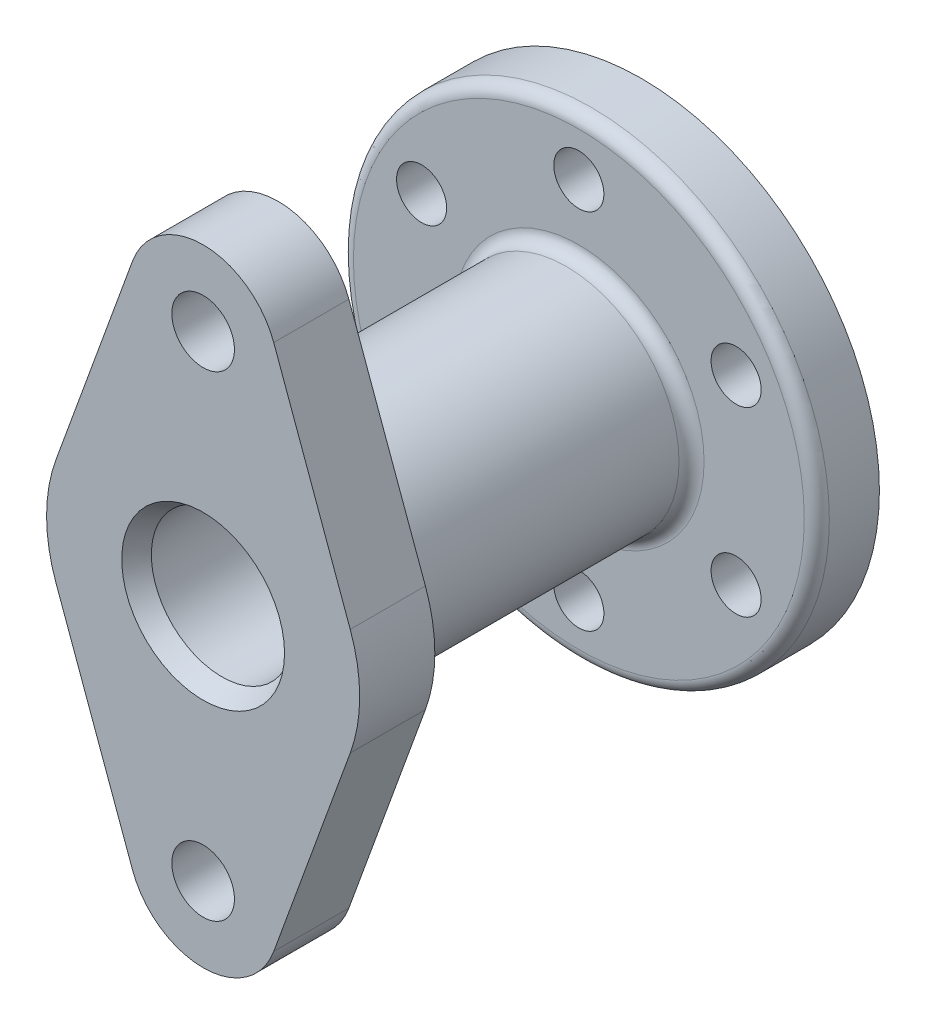
ISO-10303-21;
HEADER;
FILE_DESCRIPTION(('STEP AP214'),'2;1');
FILE_NAME('part.step','',(''),(''),'','','');
FILE_SCHEMA(('AUTOMOTIVE_DESIGN { 1 0 10303 214 1 1 1 1 }'));
ENDSEC;
DATA;
#1=APPLICATION_CONTEXT('core data for automotive mechanical design processes');
#2=APPLICATION_PROTOCOL_DEFINITION('international standard','automotive_design',2000,#1);
#3=PRODUCT_CONTEXT('',#1,'mechanical');
#4=PRODUCT('Part','Part','',(#3));
#5=PRODUCT_RELATED_PRODUCT_CATEGORY('part','',(#4));
#6=PRODUCT_DEFINITION_FORMATION('','',#4);
#7=PRODUCT_DEFINITION_CONTEXT('part definition',#1,'design');
#8=PRODUCT_DEFINITION('design','',#6,#7);
#9=PRODUCT_DEFINITION_SHAPE('','',#8);
#10=(LENGTH_UNIT() NAMED_UNIT(*) SI_UNIT(.MILLI.,.METRE.));
#11=(NAMED_UNIT(*) PLANE_ANGLE_UNIT() SI_UNIT($,.RADIAN.));
#12=(NAMED_UNIT(*) SI_UNIT($,.STERADIAN.) SOLID_ANGLE_UNIT());
#13=UNCERTAINTY_MEASURE_WITH_UNIT(LENGTH_MEASURE(1.E-05),#10,'distance_accuracy_value','');
#14=(GEOMETRIC_REPRESENTATION_CONTEXT(3) GLOBAL_UNCERTAINTY_ASSIGNED_CONTEXT((#13)) GLOBAL_UNIT_ASSIGNED_CONTEXT((#10,
#11,#12)) REPRESENTATION_CONTEXT('',''));
#15=CARTESIAN_POINT('',(0.,0.,0.));
#16=DIRECTION('',(0.,0.,1.));
#17=DIRECTION('',(1.,0.,0.));
#18=AXIS2_PLACEMENT_3D('',#15,#16,#17);
#19=CARTESIAN_POINT('',(23.4915408833646,-8.55263157894737,6.));
#20=DIRECTION('',(0.939661635334586,-0.342105263157895,0.));
#21=DIRECTION('',(0.342105263157895,0.939661635334586,0.));
#22=AXIS2_PLACEMENT_3D('',#19,#20,#21);
#23=PLANE('',#22);
#24=DIRECTION('',(-0.342105263157895,-0.939661635334586,0.));
#25=VECTOR('',#24,1.);
#26=CARTESIAN_POINT('',(23.4915408833646,-8.55263157894737,-6.));
#27=LINE('',#26,#25);
#28=CARTESIAN_POINT('',(23.4915408833646,-8.55263157894737,-6.));
#29=VERTEX_POINT('',#28);
#30=CARTESIAN_POINT('',(11.275939624015,-42.1052631578947,-6.));
#31=VERTEX_POINT('',#30);
#32=EDGE_CURVE('E244',#29,#31,#27,.T.);
#33=ORIENTED_EDGE('',*,*,#32,.F.);
#34=DIRECTION('',(0.,0.,-1.));
#35=VECTOR('',#34,1.);
#36=CARTESIAN_POINT('',(23.4915408833646,-8.55263157894737,6.));
#37=LINE('',#36,#35);
#38=CARTESIAN_POINT('',(23.4915408833646,-8.55263157894737,6.));
#39=VERTEX_POINT('',#38);
#40=EDGE_CURVE('E100',#39,#29,#37,.T.);
#41=ORIENTED_EDGE('',*,*,#40,.F.);
#42=DIRECTION('',(-0.342105263157895,-0.939661635334586,0.));
#43=VECTOR('',#42,1.);
#44=CARTESIAN_POINT('',(23.4915408833646,-8.55263157894737,6.));
#45=LINE('',#44,#43);
#46=CARTESIAN_POINT('',(11.275939624015,-42.1052631578947,6.));
#47=VERTEX_POINT('',#46);
#48=EDGE_CURVE('E219',#39,#47,#45,.T.);
#49=ORIENTED_EDGE('',*,*,#48,.T.);
#50=DIRECTION('',(0.,0.,-1.));
#51=VECTOR('',#50,1.);
#52=CARTESIAN_POINT('',(11.275939624015,-42.1052631578947,6.));
#53=LINE('',#52,#51);
#54=EDGE_CURVE('E64',#47,#31,#53,.T.);
#55=ORIENTED_EDGE('',*,*,#54,.T.);
#56=EDGE_LOOP('',(#33,#41,#49,#55));
#57=FACE_BOUND('',#56,.T.);
#58=ADVANCED_FACE('F46',(#57),#23,.T.);
#59=CARTESIAN_POINT('',(0.,0.,6.));
#60=DIRECTION('',(0.,0.,-1.));
#61=DIRECTION('',(-1.,0.,0.));
#62=AXIS2_PLACEMENT_3D('',#59,#60,#61);
#63=CYLINDRICAL_SURFACE('',#62,25.);
#64=CARTESIAN_POINT('',(0.,0.,-6.));
#65=DIRECTION('',(0.,0.,1.));
#66=DIRECTION('',(1.,0.,0.));
#67=AXIS2_PLACEMENT_3D('',#64,#65,#66);
#68=CIRCLE('',#67,25.);
#69=CARTESIAN_POINT('',(23.4915408833646,8.55263157894737,-6.));
#70=VERTEX_POINT('',#69);
#71=EDGE_CURVE('E247',#29,#70,#68,.T.);
#72=ORIENTED_EDGE('',*,*,#71,.T.);
#73=DIRECTION('',(0.,0.,-1.));
#74=VECTOR('',#73,1.);
#75=CARTESIAN_POINT('',(23.4915408833646,8.55263157894737,6.));
#76=LINE('',#75,#74);
#77=CARTESIAN_POINT('',(23.4915408833646,8.55263157894737,6.));
#78=VERTEX_POINT('',#77);
#79=EDGE_CURVE('E156',#78,#70,#76,.T.);
#80=ORIENTED_EDGE('',*,*,#79,.F.);
#81=CARTESIAN_POINT('',(0.,0.,6.));
#82=DIRECTION('',(0.,0.,1.));
#83=DIRECTION('',(1.,0.,0.));
#84=AXIS2_PLACEMENT_3D('',#81,#82,#83);
#85=CIRCLE('',#84,25.);
#86=EDGE_CURVE('E222',#39,#78,#85,.T.);
#87=ORIENTED_EDGE('',*,*,#86,.F.);
#88=ORIENTED_EDGE('',*,*,#40,.T.);
#89=EDGE_LOOP('',(#72,#80,#87,#88));
#90=FACE_BOUND('',#89,.T.);
#91=ADVANCED_FACE('F290',(#90),#63,.T.);
#92=CARTESIAN_POINT('',(23.4915408833646,8.55263157894737,6.));
#93=DIRECTION('',(-0.939661635334586,-0.342105263157895,0.));
#94=DIRECTION('',(0.342105263157895,-0.939661635334586,0.));
#95=AXIS2_PLACEMENT_3D('',#92,#93,#94);
#96=PLANE('',#95);
#97=DIRECTION('',(-0.342105263157895,0.939661635334586,0.));
#98=VECTOR('',#97,1.);
#99=CARTESIAN_POINT('',(23.4915408833646,8.55263157894737,-6.));
#100=LINE('',#99,#98);
#101=CARTESIAN_POINT('',(11.275939624015,42.1052631578947,-6.));
#102=VERTEX_POINT('',#101);
#103=EDGE_CURVE('E251',#70,#102,#100,.T.);
#104=ORIENTED_EDGE('',*,*,#103,.T.);
#105=DIRECTION('',(0.,0.,-1.));
#106=VECTOR('',#105,1.);
#107=CARTESIAN_POINT('',(11.275939624015,42.1052631578947,6.));
#108=LINE('',#107,#106);
#109=CARTESIAN_POINT('',(11.275939624015,42.1052631578947,6.));
#110=VERTEX_POINT('',#109);
#111=EDGE_CURVE('E152',#110,#102,#108,.T.);
#112=ORIENTED_EDGE('',*,*,#111,.F.);
#113=DIRECTION('',(-0.342105263157895,0.939661635334586,0.));
#114=VECTOR('',#113,1.);
#115=CARTESIAN_POINT('',(23.4915408833646,8.55263157894737,6.));
#116=LINE('',#115,#114);
#117=EDGE_CURVE('E226',#78,#110,#116,.T.);
#118=ORIENTED_EDGE('',*,*,#117,.F.);
#119=ORIENTED_EDGE('',*,*,#79,.T.);
#120=EDGE_LOOP('',(#104,#112,#118,#119));
#121=FACE_BOUND('',#120,.T.);
#122=ADVANCED_FACE('F295',(#121),#96,.F.);
#123=CARTESIAN_POINT('',(0.,38.,6.));
#124=DIRECTION('',(0.,0.,-1.));
#125=DIRECTION('',(-1.,0.,0.));
#126=AXIS2_PLACEMENT_3D('',#123,#124,#125);
#127=CYLINDRICAL_SURFACE('',#126,12.);
#128=CARTESIAN_POINT('',(0.,38.,-6.));
#129=DIRECTION('',(0.,0.,1.));
#130=DIRECTION('',(1.,0.,0.));
#131=AXIS2_PLACEMENT_3D('',#128,#129,#130);
#132=CIRCLE('',#131,12.);
#133=CARTESIAN_POINT('',(-11.275939624015,42.1052631578947,-6.));
#134=VERTEX_POINT('',#133);
#135=EDGE_CURVE('E255',#102,#134,#132,.T.);
#136=ORIENTED_EDGE('',*,*,#135,.T.);
#137=DIRECTION('',(0.,0.,-1.));
#138=VECTOR('',#137,1.);
#139=CARTESIAN_POINT('',(-11.275939624015,42.1052631578947,6.));
#140=LINE('',#139,#138);
#141=CARTESIAN_POINT('',(-11.275939624015,42.1052631578947,6.));
#142=VERTEX_POINT('',#141);
#143=EDGE_CURVE('E145',#142,#134,#140,.T.);
#144=ORIENTED_EDGE('',*,*,#143,.F.);
#145=CARTESIAN_POINT('',(0.,38.,6.));
#146=DIRECTION('',(0.,0.,1.));
#147=DIRECTION('',(1.,0.,0.));
#148=AXIS2_PLACEMENT_3D('',#145,#146,#147);
#149=CIRCLE('',#148,12.);
#150=EDGE_CURVE('E230',#110,#142,#149,.T.);
#151=ORIENTED_EDGE('',*,*,#150,.F.);
#152=ORIENTED_EDGE('',*,*,#111,.T.);
#153=EDGE_LOOP('',(#136,#144,#151,#152));
#154=FACE_BOUND('',#153,.T.);
#155=ADVANCED_FACE('F594',(#154),#127,.T.);
#156=CARTESIAN_POINT('',(-23.4915408833646,8.55263157894737,6.));
#157=DIRECTION('',(-0.939661635334586,0.342105263157895,0.));
#158=DIRECTION('',(-0.342105263157895,-0.939661635334586,0.));
#159=AXIS2_PLACEMENT_3D('',#156,#157,#158);
#160=PLANE('',#159);
#161=DIRECTION('',(0.342105263157895,0.939661635334586,0.));
#162=VECTOR('',#161,1.);
#163=CARTESIAN_POINT('',(-23.4915408833646,8.55263157894737,-6.));
#164=LINE('',#163,#162);
#165=CARTESIAN_POINT('',(-23.4915408833646,8.55263157894737,-6.));
#166=VERTEX_POINT('',#165);
#167=EDGE_CURVE('E259',#166,#134,#164,.T.);
#168=ORIENTED_EDGE('',*,*,#167,.F.);
#169=DIRECTION('',(0.,0.,-1.));
#170=VECTOR('',#169,1.);
#171=CARTESIAN_POINT('',(-23.4915408833646,8.55263157894737,6.));
#172=LINE('',#171,#170);
#173=CARTESIAN_POINT('',(-23.4915408833646,8.55263157894737,6.));
#174=VERTEX_POINT('',#173);
#175=EDGE_CURVE('E141',#174,#166,#172,.T.);
#176=ORIENTED_EDGE('',*,*,#175,.F.);
#177=DIRECTION('',(0.342105263157895,0.939661635334586,0.));
#178=VECTOR('',#177,1.);
#179=CARTESIAN_POINT('',(-23.4915408833646,8.55263157894737,6.));
#180=LINE('',#179,#178);
#181=EDGE_CURVE('E133',#174,#142,#180,.T.);
#182=ORIENTED_EDGE('',*,*,#181,.T.);
#183=ORIENTED_EDGE('',*,*,#143,.T.);
#184=EDGE_LOOP('',(#168,#176,#182,#183));
#185=FACE_BOUND('',#184,.T.);
#186=ADVANCED_FACE('F585',(#185),#160,.T.);
#187=CARTESIAN_POINT('',(0.,0.,6.));
#188=DIRECTION('',(0.,0.,-1.));
#189=DIRECTION('',(-1.,0.,0.));
#190=AXIS2_PLACEMENT_3D('',#187,#188,#189);
#191=CYLINDRICAL_SURFACE('',#190,25.);
#192=CARTESIAN_POINT('',(0.,0.,-6.));
#193=DIRECTION('',(0.,0.,1.));
#194=DIRECTION('',(1.,0.,0.));
#195=AXIS2_PLACEMENT_3D('',#192,#193,#194);
#196=CIRCLE('',#195,25.);
#197=CARTESIAN_POINT('',(-23.4915408833646,-8.55263157894737,-6.));
#198=VERTEX_POINT('',#197);
#199=EDGE_CURVE('E139',#166,#198,#196,.T.);
#200=ORIENTED_EDGE('',*,*,#199,.T.);
#201=DIRECTION('',(0.,0.,-1.));
#202=VECTOR('',#201,1.);
#203=CARTESIAN_POINT('',(-23.4915408833646,-8.55263157894737,6.));
#204=LINE('',#203,#202);
#205=CARTESIAN_POINT('',(-23.4915408833646,-8.55263157894737,6.));
#206=VERTEX_POINT('',#205);
#207=EDGE_CURVE('E120',#206,#198,#204,.T.);
#208=ORIENTED_EDGE('',*,*,#207,.F.);
#209=CARTESIAN_POINT('',(0.,0.,6.));
#210=DIRECTION('',(0.,0.,1.));
#211=DIRECTION('',(1.,0.,0.));
#212=AXIS2_PLACEMENT_3D('',#209,#210,#211);
#213=CIRCLE('',#212,25.);
#214=EDGE_CURVE('E126',#174,#206,#213,.T.);
#215=ORIENTED_EDGE('',*,*,#214,.F.);
#216=ORIENTED_EDGE('',*,*,#175,.T.);
#217=EDGE_LOOP('',(#200,#208,#215,#216));
#218=FACE_BOUND('',#217,.T.);
#219=ADVANCED_FACE('F137',(#218),#191,.T.);
#220=CARTESIAN_POINT('',(-23.4915408833646,-8.55263157894737,6.));
#221=DIRECTION('',(0.939661635334586,0.342105263157895,0.));
#222=DIRECTION('',(-0.342105263157895,0.939661635334586,0.));
#223=AXIS2_PLACEMENT_3D('',#220,#221,#222);
#224=PLANE('',#223);
#225=DIRECTION('',(0.342105263157895,-0.939661635334586,0.));
#226=VECTOR('',#225,1.);
#227=CARTESIAN_POINT('',(-23.4915408833646,-8.55263157894737,-6.));
#228=LINE('',#227,#226);
#229=CARTESIAN_POINT('',(-11.275939624015,-42.1052631578947,-6.));
#230=VERTEX_POINT('',#229);
#231=EDGE_CURVE('E265',#198,#230,#228,.T.);
#232=ORIENTED_EDGE('',*,*,#231,.T.);
#233=DIRECTION('',(0.,0.,-1.));
#234=VECTOR('',#233,1.);
#235=CARTESIAN_POINT('',(-11.275939624015,-42.1052631578947,6.));
#236=LINE('',#235,#234);
#237=CARTESIAN_POINT('',(-11.275939624015,-42.1052631578947,6.));
#238=VERTEX_POINT('',#237);
#239=EDGE_CURVE('E91',#238,#230,#236,.T.);
#240=ORIENTED_EDGE('',*,*,#239,.F.);
#241=DIRECTION('',(0.342105263157895,-0.939661635334586,0.));
#242=VECTOR('',#241,1.);
#243=CARTESIAN_POINT('',(-23.4915408833646,-8.55263157894737,6.));
#244=LINE('',#243,#242);
#245=EDGE_CURVE('E116',#206,#238,#244,.T.);
#246=ORIENTED_EDGE('',*,*,#245,.F.);
#247=ORIENTED_EDGE('',*,*,#207,.T.);
#248=EDGE_LOOP('',(#232,#240,#246,#247));
#249=FACE_BOUND('',#248,.T.);
#250=ADVANCED_FACE('F118',(#249),#224,.F.);
#251=CARTESIAN_POINT('',(0.,38.,6.));
#252=DIRECTION('',(0.,0.,-1.));
#253=DIRECTION('',(-1.,0.,0.));
#254=AXIS2_PLACEMENT_3D('',#251,#252,#253);
#255=CYLINDRICAL_SURFACE('',#254,5.);
#256=CARTESIAN_POINT('',(0.,38.,6.));
#257=DIRECTION('',(0.,0.,1.));
#258=DIRECTION('',(1.,0.,0.));
#259=AXIS2_PLACEMENT_3D('',#256,#257,#258);
#260=CIRCLE('',#259,5.);
#261=CARTESIAN_POINT('',(5.,38.,6.));
#262=VERTEX_POINT('',#261);
#263=EDGE_CURVE('E214',#262,#262,#260,.T.);
#264=ORIENTED_EDGE('',*,*,#263,.T.);
#265=EDGE_LOOP('',(#264));
#266=FACE_BOUND('',#265,.T.);
#267=CARTESIAN_POINT('',(0.,38.,-6.));
#268=DIRECTION('',(0.,0.,1.));
#269=DIRECTION('',(1.,0.,0.));
#270=AXIS2_PLACEMENT_3D('',#267,#268,#269);
#271=CIRCLE('',#270,5.);
#272=CARTESIAN_POINT('',(5.,38.,-6.));
#273=VERTEX_POINT('',#272);
#274=EDGE_CURVE('E240',#273,#273,#271,.T.);
#275=ORIENTED_EDGE('',*,*,#274,.F.);
#276=EDGE_LOOP('',(#275));
#277=FACE_BOUND('',#276,.T.);
#278=ADVANCED_FACE('F284',(#266,#277),#255,.F.);
#279=CARTESIAN_POINT('',(0.,-38.,6.));
#280=DIRECTION('',(0.,0.,-1.));
#281=DIRECTION('',(-1.,0.,0.));
#282=AXIS2_PLACEMENT_3D('',#279,#280,#281);
#283=CYLINDRICAL_SURFACE('',#282,5.);
#284=CARTESIAN_POINT('',(0.,-38.,6.));
#285=DIRECTION('',(0.,0.,1.));
#286=DIRECTION('',(1.,0.,0.));
#287=AXIS2_PLACEMENT_3D('',#284,#285,#286);
#288=CIRCLE('',#287,5.);
#289=CARTESIAN_POINT('',(5.,-38.,6.));
#290=VERTEX_POINT('',#289);
#291=EDGE_CURVE('E210',#290,#290,#288,.F.);
#292=ORIENTED_EDGE('',*,*,#291,.F.);
#293=EDGE_LOOP('',(#292));
#294=FACE_BOUND('',#293,.T.);
#295=CARTESIAN_POINT('',(0.,-38.,-6.));
#296=DIRECTION('',(0.,0.,1.));
#297=DIRECTION('',(1.,0.,0.));
#298=AXIS2_PLACEMENT_3D('',#295,#296,#297);
#299=CIRCLE('',#298,5.);
#300=CARTESIAN_POINT('',(5.,-38.,-6.));
#301=VERTEX_POINT('',#300);
#302=EDGE_CURVE('E203',#301,#301,#299,.F.);
#303=ORIENTED_EDGE('',*,*,#302,.T.);
#304=EDGE_LOOP('',(#303));
#305=FACE_BOUND('',#304,.T.);
#306=ADVANCED_FACE('F276',(#294,#305),#283,.F.);
#307=CARTESIAN_POINT('',(0.,-38.,6.));
#308=DIRECTION('',(0.,0.,-1.));
#309=DIRECTION('',(-1.,0.,0.));
#310=AXIS2_PLACEMENT_3D('',#307,#308,#309);
#311=CYLINDRICAL_SURFACE('',#310,12.);
#312=CARTESIAN_POINT('',(0.,-38.,-6.));
#313=DIRECTION('',(0.,0.,1.));
#314=DIRECTION('',(1.,0.,0.));
#315=AXIS2_PLACEMENT_3D('',#312,#313,#314);
#316=CIRCLE('',#315,12.);
#317=EDGE_CURVE('E215',#31,#230,#316,.F.);
#318=ORIENTED_EDGE('',*,*,#317,.F.);
#319=ORIENTED_EDGE('',*,*,#54,.F.);
#320=CARTESIAN_POINT('',(0.,-38.,6.));
#321=DIRECTION('',(0.,0.,1.));
#322=DIRECTION('',(1.,0.,0.));
#323=AXIS2_PLACEMENT_3D('',#320,#321,#322);
#324=CIRCLE('',#323,12.);
#325=EDGE_CURVE('E125',#47,#238,#324,.F.);
#326=ORIENTED_EDGE('',*,*,#325,.T.);
#327=ORIENTED_EDGE('',*,*,#239,.T.);
#328=EDGE_LOOP('',(#318,#319,#326,#327));
#329=FACE_BOUND('',#328,.T.);
#330=ADVANCED_FACE('F274',(#329),#311,.T.);
#331=CARTESIAN_POINT('',(0.,0.,6.));
#332=DIRECTION('',(0.,0.,1.));
#333=DIRECTION('',(1.,0.,0.));
#334=AXIS2_PLACEMENT_3D('',#331,#332,#333);
#335=PLANE('',#334);
#336=CARTESIAN_POINT('',(0.,0.,6.));
#337=DIRECTION('',(0.,0.,1.));
#338=DIRECTION('',(1.,0.,0.));
#339=AXIS2_PLACEMENT_3D('',#336,#337,#338);
#340=CIRCLE('',#339,13.);
#341=CARTESIAN_POINT('',(13.,0.,6.));
#342=VERTEX_POINT('',#341);
#343=EDGE_CURVE('E197',#342,#342,#340,.T.);
#344=ORIENTED_EDGE('',*,*,#343,.F.);
#345=EDGE_LOOP('',(#344));
#346=FACE_BOUND('',#345,.T.);
#347=ORIENTED_EDGE('',*,*,#291,.T.);
#348=EDGE_LOOP('',(#347));
#349=FACE_BOUND('',#348,.T.);
#350=ORIENTED_EDGE('',*,*,#263,.F.);
#351=EDGE_LOOP('',(#350));
#352=FACE_BOUND('',#351,.T.);
#353=ORIENTED_EDGE('',*,*,#48,.F.);
#354=ORIENTED_EDGE('',*,*,#86,.T.);
#355=ORIENTED_EDGE('',*,*,#117,.T.);
#356=ORIENTED_EDGE('',*,*,#150,.T.);
#357=ORIENTED_EDGE('',*,*,#181,.F.);
#358=ORIENTED_EDGE('',*,*,#214,.T.);
#359=ORIENTED_EDGE('',*,*,#245,.T.);
#360=ORIENTED_EDGE('',*,*,#325,.F.);
#361=EDGE_LOOP('',(#353,#354,#355,#356,#357,#358,#359,#360));
#362=FACE_BOUND('',#361,.T.);
#363=ADVANCED_FACE('F131',(#346,#349,#352,#362),#335,.T.);
#364=CARTESIAN_POINT('',(0.,0.,-6.));
#365=DIRECTION('',(0.,0.,1.));
#366=DIRECTION('',(1.,0.,0.));
#367=AXIS2_PLACEMENT_3D('',#364,#365,#366);
#368=PLANE('',#367);
#369=CARTESIAN_POINT('',(0.,0.,-6.));
#370=DIRECTION('',(0.,0.,1.));
#371=DIRECTION('',(1.,0.,0.));
#372=AXIS2_PLACEMENT_3D('',#369,#370,#371);
#373=CIRCLE('',#372,18.);
#374=CARTESIAN_POINT('',(18.,0.,-6.));
#375=VERTEX_POINT('',#374);
#376=EDGE_CURVE('E162',#375,#375,#373,.F.);
#377=ORIENTED_EDGE('',*,*,#376,.F.);
#378=EDGE_LOOP('',(#377));
#379=FACE_BOUND('',#378,.T.);
#380=ORIENTED_EDGE('',*,*,#302,.F.);
#381=EDGE_LOOP('',(#380));
#382=FACE_BOUND('',#381,.T.);
#383=ORIENTED_EDGE('',*,*,#274,.T.);
#384=EDGE_LOOP('',(#383));
#385=FACE_BOUND('',#384,.T.);
#386=ORIENTED_EDGE('',*,*,#32,.T.);
#387=ORIENTED_EDGE('',*,*,#317,.T.);
#388=ORIENTED_EDGE('',*,*,#231,.F.);
#389=ORIENTED_EDGE('',*,*,#199,.F.);
#390=ORIENTED_EDGE('',*,*,#167,.T.);
#391=ORIENTED_EDGE('',*,*,#135,.F.);
#392=ORIENTED_EDGE('',*,*,#103,.F.);
#393=ORIENTED_EDGE('',*,*,#71,.F.);
#394=EDGE_LOOP('',(#386,#387,#388,#389,#390,#391,#392,#393));
#395=FACE_BOUND('',#394,.T.);
#396=ADVANCED_FACE('F272',(#379,#382,#385,#395),#368,.F.);
#397=CARTESIAN_POINT('',(0.,0.,6.));
#398=DIRECTION('',(0.,0.,1.));
#399=DIRECTION('',(1.,0.,0.));
#400=AXIS2_PLACEMENT_3D('',#397,#398,#399);
#401=CONICAL_SURFACE('',#400,13.,0.5235987755983);
#402=CARTESIAN_POINT('',(0.,0.,3.));
#403=DIRECTION('',(0.,0.,1.));
#404=DIRECTION('',(1.,0.,0.));
#405=AXIS2_PLACEMENT_3D('',#402,#403,#404);
#406=CIRCLE('',#405,11.2679491924311);
#407=CARTESIAN_POINT('',(11.2679491924311,0.,3.));
#408=VERTEX_POINT('',#407);
#409=EDGE_CURVE('E206',#408,#408,#406,.T.);
#410=ORIENTED_EDGE('',*,*,#409,.F.);
#411=EDGE_LOOP('',(#410));
#412=FACE_BOUND('',#411,.T.);
#413=ORIENTED_EDGE('',*,*,#343,.T.);
#414=EDGE_LOOP('',(#413));
#415=FACE_BOUND('',#414,.T.);
#416=ADVANCED_FACE('F310',(#412,#415),#401,.F.);
#417=CARTESIAN_POINT('',(0.,0.,-54.));
#418=DIRECTION('',(0.,0.,1.));
#419=DIRECTION('',(1.,0.,0.));
#420=AXIS2_PLACEMENT_3D('',#417,#418,#419);
#421=CYLINDRICAL_SURFACE('',#420,18.);
#422=CARTESIAN_POINT('',(0.,0.,-52.));
#423=DIRECTION('',(0.,0.,-1.));
#424=DIRECTION('',(-1.,0.,0.));
#425=AXIS2_PLACEMENT_3D('',#422,#423,#424);
#426=CIRCLE('',#425,18.);
#427=CARTESIAN_POINT('',(-18.,0.,-52.));
#428=VERTEX_POINT('',#427);
#429=EDGE_CURVE('E11',#428,#428,#426,.F.);
#430=ORIENTED_EDGE('',*,*,#429,.T.);
#431=EDGE_LOOP('',(#430));
#432=FACE_BOUND('',#431,.T.);
#433=ORIENTED_EDGE('',*,*,#376,.T.);
#434=EDGE_LOOP('',(#433));
#435=FACE_BOUND('',#434,.T.);
#436=ADVANCED_FACE('F190',(#432,#435),#421,.T.);
#437=CARTESIAN_POINT('',(0.,0.,-64.));
#438=DIRECTION('',(0.,0.,1.));
#439=DIRECTION('',(1.,0.,0.));
#440=AXIS2_PLACEMENT_3D('',#437,#438,#439);
#441=CYLINDRICAL_SURFACE('',#440,38.);
#442=CARTESIAN_POINT('',(0.,0.,-56.));
#443=DIRECTION('',(0.,0.,-1.));
#444=DIRECTION('',(-1.,0.,0.));
#445=AXIS2_PLACEMENT_3D('',#442,#443,#444);
#446=CIRCLE('',#445,38.);
#447=CARTESIAN_POINT('',(-38.,0.,-56.));
#448=VERTEX_POINT('',#447);
#449=EDGE_CURVE('E166',#448,#448,#446,.T.);
#450=ORIENTED_EDGE('',*,*,#449,.T.);
#451=EDGE_LOOP('',(#450));
#452=FACE_BOUND('',#451,.T.);
#453=CARTESIAN_POINT('',(0.,0.,-64.));
#454=DIRECTION('',(0.,0.,-1.));
#455=DIRECTION('',(-1.,0.,0.));
#456=AXIS2_PLACEMENT_3D('',#453,#454,#455);
#457=CIRCLE('',#456,38.);
#458=CARTESIAN_POINT('',(-38.,0.,-64.));
#459=VERTEX_POINT('',#458);
#460=EDGE_CURVE('E194',#459,#459,#457,.T.);
#461=ORIENTED_EDGE('',*,*,#460,.F.);
#462=EDGE_LOOP('',(#461));
#463=FACE_BOUND('',#462,.T.);
#464=ADVANCED_FACE('F186',(#452,#463),#441,.T.);
#465=CARTESIAN_POINT('',(0.,0.,-64.));
#466=DIRECTION('',(0.,0.,-1.));
#467=DIRECTION('',(-1.,0.,0.));
#468=AXIS2_PLACEMENT_3D('',#465,#466,#467);
#469=PLANE('',#468);
#470=CARTESIAN_POINT('',(0.,29.,-64.));
#471=DIRECTION('',(0.,0.,1.));
#472=DIRECTION('',(1.,0.,0.));
#473=AXIS2_PLACEMENT_3D('',#470,#471,#472);
#474=CIRCLE('',#473,4.);
#475=CARTESIAN_POINT('',(4.,29.,-64.));
#476=VERTEX_POINT('',#475);
#477=EDGE_CURVE('E367',#476,#476,#474,.T.);
#478=ORIENTED_EDGE('',*,*,#477,.T.);
#479=EDGE_LOOP('',(#478));
#480=FACE_BOUND('',#479,.T.);
#481=CARTESIAN_POINT('',(-25.1147367097486,14.5000000000003,-64.));
#482=DIRECTION('',(0.,0.,1.));
#483=DIRECTION('',(1.,0.,0.));
#484=AXIS2_PLACEMENT_3D('',#481,#482,#483);
#485=CIRCLE('',#484,4.);
#486=CARTESIAN_POINT('',(-21.1147367097486,14.5000000000003,-64.));
#487=VERTEX_POINT('',#486);
#488=EDGE_CURVE('E388',#487,#487,#485,.T.);
#489=ORIENTED_EDGE('',*,*,#488,.T.);
#490=EDGE_LOOP('',(#489));
#491=FACE_BOUND('',#490,.T.);
#492=CARTESIAN_POINT('',(-25.1147367097489,-14.4999999999998,-64.));
#493=DIRECTION('',(0.,0.,1.));
#494=DIRECTION('',(1.,0.,0.));
#495=AXIS2_PLACEMENT_3D('',#492,#493,#494);
#496=CIRCLE('',#495,4.);
#497=CARTESIAN_POINT('',(-21.1147367097489,-14.4999999999998,-64.));
#498=VERTEX_POINT('',#497);
#499=EDGE_CURVE('E387',#498,#498,#496,.T.);
#500=ORIENTED_EDGE('',*,*,#499,.T.);
#501=EDGE_LOOP('',(#500));
#502=FACE_BOUND('',#501,.T.);
#503=CARTESIAN_POINT('',(-2.02505917652902E-13,-29.,-64.));
#504=DIRECTION('',(0.,0.,1.));
#505=DIRECTION('',(1.,0.,0.));
#506=AXIS2_PLACEMENT_3D('',#503,#504,#505);
#507=CIRCLE('',#506,4.);
#508=CARTESIAN_POINT('',(3.9999999999998,-29.,-64.));
#509=VERTEX_POINT('',#508);
#510=EDGE_CURVE('E407',#509,#509,#507,.T.);
#511=ORIENTED_EDGE('',*,*,#510,.T.);
#512=EDGE_LOOP('',(#511));
#513=FACE_BOUND('',#512,.T.);
#514=CARTESIAN_POINT('',(25.1147367097486,-14.5000000000001,-64.));
#515=DIRECTION('',(0.,0.,1.));
#516=DIRECTION('',(1.,0.,0.));
#517=AXIS2_PLACEMENT_3D('',#514,#515,#516);
#518=CIRCLE('',#517,4.);
#519=CARTESIAN_POINT('',(29.1147367097486,-14.5000000000001,-64.));
#520=VERTEX_POINT('',#519);
#521=EDGE_CURVE('E399',#520,#520,#518,.T.);
#522=ORIENTED_EDGE('',*,*,#521,.T.);
#523=EDGE_LOOP('',(#522));
#524=FACE_BOUND('',#523,.T.);
#525=CARTESIAN_POINT('',(25.1147367097488,14.4999999999999,-64.));
#526=DIRECTION('',(0.,0.,1.));
#527=DIRECTION('',(1.,0.,0.));
#528=AXIS2_PLACEMENT_3D('',#525,#526,#527);
#529=CIRCLE('',#528,4.);
#530=CARTESIAN_POINT('',(29.1147367097488,14.4999999999999,-64.));
#531=VERTEX_POINT('',#530);
#532=EDGE_CURVE('E380',#531,#531,#529,.T.);
#533=ORIENTED_EDGE('',*,*,#532,.T.);
#534=EDGE_LOOP('',(#533));
#535=FACE_BOUND('',#534,.T.);
#536=CARTESIAN_POINT('',(0.,0.,-64.));
#537=DIRECTION('',(0.,0.,1.));
#538=DIRECTION('',(1.,0.,0.));
#539=AXIS2_PLACEMENT_3D('',#536,#537,#538);
#540=CIRCLE('',#539,10.);
#541=CARTESIAN_POINT('',(10.,0.,-64.));
#542=VERTEX_POINT('',#541);
#543=EDGE_CURVE('E418',#542,#542,#540,.T.);
#544=ORIENTED_EDGE('',*,*,#543,.T.);
#545=EDGE_LOOP('',(#544));
#546=FACE_BOUND('',#545,.T.);
#547=ORIENTED_EDGE('',*,*,#460,.T.);
#548=EDGE_LOOP('',(#547));
#549=FACE_BOUND('',#548,.T.);
#550=ADVANCED_FACE('F189',(#480,#491,#502,#513,#524,#535,#546,#549),#469,.T.);
#551=CARTESIAN_POINT('',(0.,0.,-54.));
#552=DIRECTION('',(0.,0.,-1.));
#553=DIRECTION('',(-1.,0.,0.));
#554=AXIS2_PLACEMENT_3D('',#551,#552,#553);
#555=PLANE('',#554);
#556=CARTESIAN_POINT('',(0.,0.,-54.));
#557=DIRECTION('',(0.,0.,-1.));
#558=DIRECTION('',(-1.,0.,0.));
#559=AXIS2_PLACEMENT_3D('',#556,#557,#558);
#560=CIRCLE('',#559,36.);
#561=CARTESIAN_POINT('',(-36.,0.,-54.));
#562=VERTEX_POINT('',#561);
#563=EDGE_CURVE('E56',#562,#562,#560,.F.);
#564=ORIENTED_EDGE('',*,*,#563,.T.);
#565=EDGE_LOOP('',(#564));
#566=FACE_BOUND('',#565,.T.);
#567=CARTESIAN_POINT('',(0.,0.,-54.));
#568=DIRECTION('',(0.,0.,-1.));
#569=DIRECTION('',(-1.,0.,0.));
#570=AXIS2_PLACEMENT_3D('',#567,#568,#569);
#571=CIRCLE('',#570,20.);
#572=CARTESIAN_POINT('',(-20.,0.,-54.));
#573=VERTEX_POINT('',#572);
#574=EDGE_CURVE('E170',#573,#573,#571,.T.);
#575=ORIENTED_EDGE('',*,*,#574,.T.);
#576=EDGE_LOOP('',(#575));
#577=FACE_BOUND('',#576,.T.);
#578=CARTESIAN_POINT('',(0.,29.,-54.));
#579=DIRECTION('',(0.,0.,1.));
#580=DIRECTION('',(1.,0.,0.));
#581=AXIS2_PLACEMENT_3D('',#578,#579,#580);
#582=CIRCLE('',#581,4.);
#583=CARTESIAN_POINT('',(4.,29.,-54.));
#584=VERTEX_POINT('',#583);
#585=EDGE_CURVE('E370',#584,#584,#582,.T.);
#586=ORIENTED_EDGE('',*,*,#585,.F.);
#587=EDGE_LOOP('',(#586));
#588=FACE_BOUND('',#587,.T.);
#589=CARTESIAN_POINT('',(-25.1147367097486,14.5000000000003,-54.));
#590=DIRECTION('',(0.,0.,1.));
#591=DIRECTION('',(1.,0.,0.));
#592=AXIS2_PLACEMENT_3D('',#589,#590,#591);
#593=CIRCLE('',#592,4.);
#594=CARTESIAN_POINT('',(-21.1147367097486,14.5000000000003,-54.));
#595=VERTEX_POINT('',#594);
#596=EDGE_CURVE('E383',#595,#595,#593,.T.);
#597=ORIENTED_EDGE('',*,*,#596,.F.);
#598=EDGE_LOOP('',(#597));
#599=FACE_BOUND('',#598,.T.);
#600=CARTESIAN_POINT('',(-25.1147367097489,-14.4999999999998,-54.));
#601=DIRECTION('',(0.,0.,1.));
#602=DIRECTION('',(1.,0.,0.));
#603=AXIS2_PLACEMENT_3D('',#600,#601,#602);
#604=CIRCLE('',#603,4.);
#605=CARTESIAN_POINT('',(-21.1147367097489,-14.4999999999998,-54.));
#606=VERTEX_POINT('',#605);
#607=EDGE_CURVE('E411',#606,#606,#604,.T.);
#608=ORIENTED_EDGE('',*,*,#607,.F.);
#609=EDGE_LOOP('',(#608));
#610=FACE_BOUND('',#609,.T.);
#611=CARTESIAN_POINT('',(-2.02505917652902E-13,-29.,-54.));
#612=DIRECTION('',(0.,0.,1.));
#613=DIRECTION('',(1.,0.,0.));
#614=AXIS2_PLACEMENT_3D('',#611,#612,#613);
#615=CIRCLE('',#614,4.);
#616=CARTESIAN_POINT('',(3.9999999999998,-29.,-54.));
#617=VERTEX_POINT('',#616);
#618=EDGE_CURVE('E403',#617,#617,#615,.T.);
#619=ORIENTED_EDGE('',*,*,#618,.F.);
#620=EDGE_LOOP('',(#619));
#621=FACE_BOUND('',#620,.T.);
#622=CARTESIAN_POINT('',(25.1147367097486,-14.5000000000001,-54.));
#623=DIRECTION('',(0.,0.,1.));
#624=DIRECTION('',(1.,0.,0.));
#625=AXIS2_PLACEMENT_3D('',#622,#623,#624);
#626=CIRCLE('',#625,4.);
#627=CARTESIAN_POINT('',(29.1147367097486,-14.5000000000001,-54.));
#628=VERTEX_POINT('',#627);
#629=EDGE_CURVE('E395',#628,#628,#626,.T.);
#630=ORIENTED_EDGE('',*,*,#629,.F.);
#631=EDGE_LOOP('',(#630));
#632=FACE_BOUND('',#631,.T.);
#633=CARTESIAN_POINT('',(25.1147367097488,14.4999999999999,-54.));
#634=DIRECTION('',(0.,0.,1.));
#635=DIRECTION('',(1.,0.,0.));
#636=AXIS2_PLACEMENT_3D('',#633,#634,#635);
#637=CIRCLE('',#636,4.);
#638=CARTESIAN_POINT('',(29.1147367097488,14.4999999999999,-54.));
#639=VERTEX_POINT('',#638);
#640=EDGE_CURVE('E373',#639,#639,#637,.T.);
#641=ORIENTED_EDGE('',*,*,#640,.F.);
#642=EDGE_LOOP('',(#641));
#643=FACE_BOUND('',#642,.T.);
#644=ADVANCED_FACE('F177',(#566,#577,#588,#599,#610,#621,#632,#643),#555,.F.);
#645=CARTESIAN_POINT('',(0.,0.,-22.));
#646=DIRECTION('',(0.,0.,1.));
#647=DIRECTION('',(1.,0.,0.));
#648=AXIS2_PLACEMENT_3D('',#645,#646,#647);
#649=CYLINDRICAL_SURFACE('',#648,11.2679491924311);
#650=CARTESIAN_POINT('',(0.,0.,-22.));
#651=DIRECTION('',(0.,0.,1.));
#652=DIRECTION('',(1.,0.,0.));
#653=AXIS2_PLACEMENT_3D('',#650,#651,#652);
#654=CIRCLE('',#653,11.2679491924311);
#655=CARTESIAN_POINT('',(11.2679491924311,0.,-22.));
#656=VERTEX_POINT('',#655);
#657=EDGE_CURVE('E198',#656,#656,#654,.T.);
#658=ORIENTED_EDGE('',*,*,#657,.F.);
#659=EDGE_LOOP('',(#658));
#660=FACE_BOUND('',#659,.T.);
#661=ORIENTED_EDGE('',*,*,#409,.T.);
#662=EDGE_LOOP('',(#661));
#663=FACE_BOUND('',#662,.T.);
#664=ADVANCED_FACE('F326',(#660,#663),#649,.F.);
#665=CARTESIAN_POINT('',(0.,0.,-22.));
#666=DIRECTION('',(0.,0.,1.));
#667=DIRECTION('',(1.,0.,0.));
#668=AXIS2_PLACEMENT_3D('',#665,#666,#667);
#669=PLANE('',#668);
#670=CARTESIAN_POINT('',(0.,0.,-22.));
#671=DIRECTION('',(0.,0.,1.));
#672=DIRECTION('',(1.,0.,0.));
#673=AXIS2_PLACEMENT_3D('',#670,#671,#672);
#674=CIRCLE('',#673,10.);
#675=CARTESIAN_POINT('',(10.,0.,-22.));
#676=VERTEX_POINT('',#675);
#677=EDGE_CURVE('E377',#676,#676,#674,.T.);
#678=ORIENTED_EDGE('',*,*,#677,.F.);
#679=EDGE_LOOP('',(#678));
#680=FACE_BOUND('',#679,.T.);
#681=ORIENTED_EDGE('',*,*,#657,.T.);
#682=EDGE_LOOP('',(#681));
#683=FACE_BOUND('',#682,.T.);
#684=ADVANCED_FACE('F331',(#680,#683),#669,.T.);
#685=CARTESIAN_POINT('',(0.,0.,-64.));
#686=DIRECTION('',(0.,0.,1.));
#687=DIRECTION('',(1.,0.,0.));
#688=AXIS2_PLACEMENT_3D('',#685,#686,#687);
#689=CYLINDRICAL_SURFACE('',#688,10.);
#690=ORIENTED_EDGE('',*,*,#543,.F.);
#691=EDGE_LOOP('',(#690));
#692=FACE_BOUND('',#691,.T.);
#693=ORIENTED_EDGE('',*,*,#677,.T.);
#694=EDGE_LOOP('',(#693));
#695=FACE_BOUND('',#694,.T.);
#696=ADVANCED_FACE('F335',(#692,#695),#689,.F.);
#697=CARTESIAN_POINT('',(25.1147367097488,14.4999999999999,-64.));
#698=DIRECTION('',(0.,0.,1.));
#699=DIRECTION('',(1.,0.,0.));
#700=AXIS2_PLACEMENT_3D('',#697,#698,#699);
#701=CYLINDRICAL_SURFACE('',#700,4.);
#702=ORIENTED_EDGE('',*,*,#532,.F.);
#703=EDGE_LOOP('',(#702));
#704=FACE_BOUND('',#703,.T.);
#705=ORIENTED_EDGE('',*,*,#640,.T.);
#706=EDGE_LOOP('',(#705));
#707=FACE_BOUND('',#706,.T.);
#708=ADVANCED_FACE('F339',(#704,#707),#701,.F.);
#709=CARTESIAN_POINT('',(25.1147367097486,-14.5000000000001,-64.));
#710=DIRECTION('',(0.,0.,1.));
#711=DIRECTION('',(1.,0.,0.));
#712=AXIS2_PLACEMENT_3D('',#709,#710,#711);
#713=CYLINDRICAL_SURFACE('',#712,4.);
#714=ORIENTED_EDGE('',*,*,#521,.F.);
#715=EDGE_LOOP('',(#714));
#716=FACE_BOUND('',#715,.T.);
#717=ORIENTED_EDGE('',*,*,#629,.T.);
#718=EDGE_LOOP('',(#717));
#719=FACE_BOUND('',#718,.T.);
#720=ADVANCED_FACE('F349',(#716,#719),#713,.F.);
#721=CARTESIAN_POINT('',(-2.02505917652902E-13,-29.,-64.));
#722=DIRECTION('',(0.,0.,1.));
#723=DIRECTION('',(1.,0.,0.));
#724=AXIS2_PLACEMENT_3D('',#721,#722,#723);
#725=CYLINDRICAL_SURFACE('',#724,4.);
#726=ORIENTED_EDGE('',*,*,#510,.F.);
#727=EDGE_LOOP('',(#726));
#728=FACE_BOUND('',#727,.T.);
#729=ORIENTED_EDGE('',*,*,#618,.T.);
#730=EDGE_LOOP('',(#729));
#731=FACE_BOUND('',#730,.T.);
#732=ADVANCED_FACE('F345',(#728,#731),#725,.F.);
#733=CARTESIAN_POINT('',(-25.1147367097489,-14.4999999999998,-64.));
#734=DIRECTION('',(0.,0.,1.));
#735=DIRECTION('',(1.,0.,0.));
#736=AXIS2_PLACEMENT_3D('',#733,#734,#735);
#737=CYLINDRICAL_SURFACE('',#736,4.);
#738=ORIENTED_EDGE('',*,*,#499,.F.);
#739=EDGE_LOOP('',(#738));
#740=FACE_BOUND('',#739,.T.);
#741=ORIENTED_EDGE('',*,*,#607,.T.);
#742=EDGE_LOOP('',(#741));
#743=FACE_BOUND('',#742,.T.);
#744=ADVANCED_FACE('F341',(#740,#743),#737,.F.);
#745=CARTESIAN_POINT('',(-25.1147367097486,14.5000000000003,-64.));
#746=DIRECTION('',(0.,0.,1.));
#747=DIRECTION('',(1.,0.,0.));
#748=AXIS2_PLACEMENT_3D('',#745,#746,#747);
#749=CYLINDRICAL_SURFACE('',#748,4.);
#750=ORIENTED_EDGE('',*,*,#488,.F.);
#751=EDGE_LOOP('',(#750));
#752=FACE_BOUND('',#751,.T.);
#753=ORIENTED_EDGE('',*,*,#596,.T.);
#754=EDGE_LOOP('',(#753));
#755=FACE_BOUND('',#754,.T.);
#756=ADVANCED_FACE('F344',(#752,#755),#749,.F.);
#757=CARTESIAN_POINT('',(0.,29.,-64.));
#758=DIRECTION('',(0.,0.,1.));
#759=DIRECTION('',(1.,0.,0.));
#760=AXIS2_PLACEMENT_3D('',#757,#758,#759);
#761=CYLINDRICAL_SURFACE('',#760,4.);
#762=ORIENTED_EDGE('',*,*,#477,.F.);
#763=EDGE_LOOP('',(#762));
#764=FACE_BOUND('',#763,.T.);
#765=ORIENTED_EDGE('',*,*,#585,.T.);
#766=EDGE_LOOP('',(#765));
#767=FACE_BOUND('',#766,.T.);
#768=ADVANCED_FACE('F183',(#764,#767),#761,.F.);
#769=CARTESIAN_POINT('',(0.,0.,-56.));
#770=DIRECTION('',(0.,0.,-1.));
#771=DIRECTION('',(-1.,0.,0.));
#772=AXIS2_PLACEMENT_3D('',#769,#770,#771);
#773=TOROIDAL_SURFACE('',#772,36.,2.);
#774=ORIENTED_EDGE('',*,*,#563,.F.);
#775=EDGE_LOOP('',(#774));
#776=FACE_BOUND('',#775,.T.);
#777=ORIENTED_EDGE('',*,*,#449,.F.);
#778=EDGE_LOOP('',(#777));
#779=FACE_BOUND('',#778,.T.);
#780=ADVANCED_FACE('F180',(#776,#779),#773,.T.);
#781=CARTESIAN_POINT('',(0.,0.,-52.));
#782=DIRECTION('',(0.,0.,-1.));
#783=DIRECTION('',(-1.,0.,0.));
#784=AXIS2_PLACEMENT_3D('',#781,#782,#783);
#785=TOROIDAL_SURFACE('',#784,20.,2.);
#786=ORIENTED_EDGE('',*,*,#429,.F.);
#787=EDGE_LOOP('',(#786));
#788=FACE_BOUND('',#787,.T.);
#789=ORIENTED_EDGE('',*,*,#574,.F.);
#790=EDGE_LOOP('',(#789));
#791=FACE_BOUND('',#790,.T.);
#792=ADVANCED_FACE('F48',(#788,#791),#785,.F.);
#793=CLOSED_SHELL('',(#58,#91,#122,#155,#186,#219,#250,#278,#306,#330,#363,#396,#416,#436,#464,
#550,#644,#664,#684,#696,#708,#720,#732,#744,#756,#768,#780,#792));
#794=MANIFOLD_SOLID_BREP('B2',#793);
#795=ADVANCED_BREP_SHAPE_REPRESENTATION('',(#18,#794),#14);
#796=SHAPE_DEFINITION_REPRESENTATION(#9,#795);
ENDSEC;
END-ISO-10303-21;
